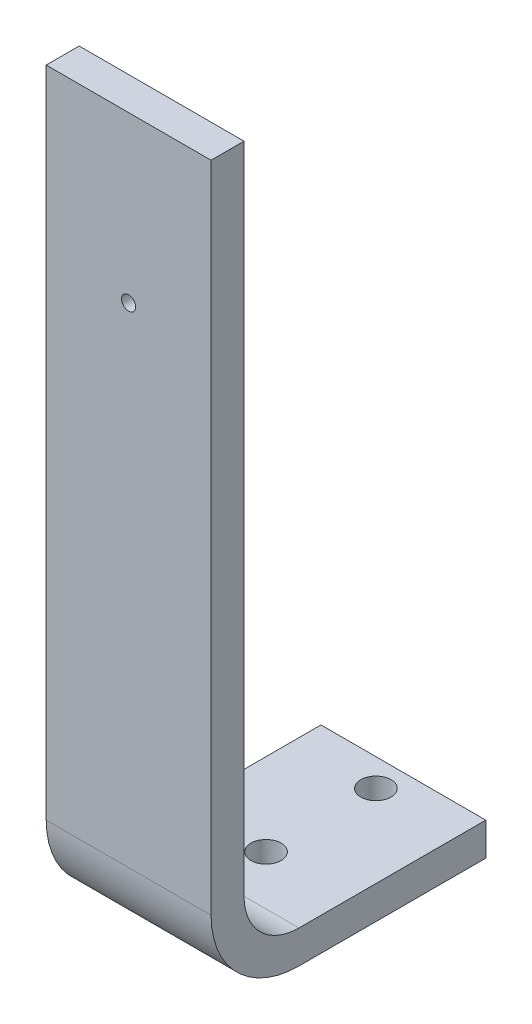
ISO-10303-21;
HEADER;
FILE_DESCRIPTION(('STEP AP214'),'2;1');
FILE_NAME('part.step','',(''),(''),'','','');
FILE_SCHEMA(('AUTOMOTIVE_DESIGN { 1 0 10303 214 1 1 1 1 }'));
ENDSEC;
DATA;
#1=APPLICATION_CONTEXT('core data for automotive mechanical design processes');
#2=APPLICATION_PROTOCOL_DEFINITION('international standard','automotive_design',2000,#1);
#3=PRODUCT_CONTEXT('',#1,'mechanical');
#4=PRODUCT('Part','Part','',(#3));
#5=PRODUCT_RELATED_PRODUCT_CATEGORY('part','',(#4));
#6=PRODUCT_DEFINITION_FORMATION('','',#4);
#7=PRODUCT_DEFINITION_CONTEXT('part definition',#1,'design');
#8=PRODUCT_DEFINITION('design','',#6,#7);
#9=PRODUCT_DEFINITION_SHAPE('','',#8);
#10=(LENGTH_UNIT() NAMED_UNIT(*) SI_UNIT(.MILLI.,.METRE.));
#11=(NAMED_UNIT(*) PLANE_ANGLE_UNIT() SI_UNIT($,.RADIAN.));
#12=(NAMED_UNIT(*) SI_UNIT($,.STERADIAN.) SOLID_ANGLE_UNIT());
#13=UNCERTAINTY_MEASURE_WITH_UNIT(LENGTH_MEASURE(1.E-05),#10,'distance_accuracy_value','');
#14=(GEOMETRIC_REPRESENTATION_CONTEXT(3) GLOBAL_UNCERTAINTY_ASSIGNED_CONTEXT((#13)) GLOBAL_UNIT_ASSIGNED_CONTEXT((#10,
#11,#12)) REPRESENTATION_CONTEXT('',''));
#15=CARTESIAN_POINT('',(0.,0.,0.));
#16=DIRECTION('',(0.,0.,1.));
#17=DIRECTION('',(1.,0.,0.));
#18=AXIS2_PLACEMENT_3D('',#15,#16,#17);
#19=CARTESIAN_POINT('',(30.,0.,0.));
#20=DIRECTION('',(0.,0.,-1.));
#21=DIRECTION('',(-1.,0.,0.));
#22=AXIS2_PLACEMENT_3D('',#19,#20,#21);
#23=PLANE('',#22);
#24=CARTESIAN_POINT('',(15.,105.,0.));
#25=DIRECTION('',(0.,0.,1.));
#26=DIRECTION('',(1.,0.,0.));
#27=AXIS2_PLACEMENT_3D('',#24,#25,#26);
#28=CIRCLE('',#27,1.28905);
#29=CARTESIAN_POINT('',(16.28905,105.,0.));
#30=VERTEX_POINT('',#29);
#31=EDGE_CURVE('E198',#30,#30,#28,.T.);
#32=ORIENTED_EDGE('',*,*,#31,.F.);
#33=EDGE_LOOP('',(#32));
#34=FACE_BOUND('',#33,.T.);
#35=DIRECTION('',(0.,-1.,0.));
#36=VECTOR('',#35,1.);
#37=CARTESIAN_POINT('',(0.,0.,0.));
#38=LINE('',#37,#36);
#39=CARTESIAN_POINT('',(0.,135.,0.));
#40=VERTEX_POINT('',#39);
#41=CARTESIAN_POINT('',(0.,16.,0.));
#42=VERTEX_POINT('',#41);
#43=EDGE_CURVE('E134',#40,#42,#38,.T.);
#44=ORIENTED_EDGE('',*,*,#43,.T.);
#45=DIRECTION('',(-1.,0.,0.));
#46=VECTOR('',#45,1.);
#47=CARTESIAN_POINT('',(30.,16.,0.));
#48=LINE('',#47,#46);
#49=CARTESIAN_POINT('',(30.,16.,0.));
#50=VERTEX_POINT('',#49);
#51=EDGE_CURVE('E43',#42,#50,#48,.F.);
#52=ORIENTED_EDGE('',*,*,#51,.T.);
#53=DIRECTION('',(0.,-1.,0.));
#54=VECTOR('',#53,1.);
#55=CARTESIAN_POINT('',(30.,0.,0.));
#56=LINE('',#55,#54);
#57=CARTESIAN_POINT('',(30.,135.,0.));
#58=VERTEX_POINT('',#57);
#59=EDGE_CURVE('E110',#58,#50,#56,.T.);
#60=ORIENTED_EDGE('',*,*,#59,.F.);
#61=DIRECTION('',(-1.,0.,0.));
#62=VECTOR('',#61,1.);
#63=CARTESIAN_POINT('',(30.,135.,0.));
#64=LINE('',#63,#62);
#65=EDGE_CURVE('E133',#58,#40,#64,.T.);
#66=ORIENTED_EDGE('',*,*,#65,.T.);
#67=EDGE_LOOP('',(#44,#52,#60,#66));
#68=FACE_BOUND('',#67,.T.);
#69=ADVANCED_FACE('F35',(#34,#68),#23,.F.);
#70=CARTESIAN_POINT('',(30.,0.,0.));
#71=DIRECTION('',(0.,1.,0.));
#72=DIRECTION('',(0.,0.,1.));
#73=AXIS2_PLACEMENT_3D('',#70,#71,#72);
#74=PLANE('',#73);
#75=CARTESIAN_POINT('',(15.,0.,-45.));
#76=DIRECTION('',(0.,1.,0.));
#77=DIRECTION('',(0.,0.,1.));
#78=AXIS2_PLACEMENT_3D('',#75,#76,#77);
#79=CIRCLE('',#78,2.75);
#80=CARTESIAN_POINT('',(15.,0.,-42.25));
#81=VERTEX_POINT('',#80);
#82=EDGE_CURVE('E189',#81,#81,#79,.T.);
#83=ORIENTED_EDGE('',*,*,#82,.T.);
#84=EDGE_LOOP('',(#83));
#85=FACE_BOUND('',#84,.T.);
#86=CARTESIAN_POINT('',(15.,0.,-25.));
#87=DIRECTION('',(0.,1.,0.));
#88=DIRECTION('',(0.,0.,1.));
#89=AXIS2_PLACEMENT_3D('',#86,#87,#88);
#90=CIRCLE('',#89,2.75);
#91=CARTESIAN_POINT('',(15.,0.,-22.25));
#92=VERTEX_POINT('',#91);
#93=EDGE_CURVE('E136',#92,#92,#90,.T.);
#94=ORIENTED_EDGE('',*,*,#93,.T.);
#95=EDGE_LOOP('',(#94));
#96=FACE_BOUND('',#95,.T.);
#97=DIRECTION('',(0.,0.,-1.));
#98=VECTOR('',#97,1.);
#99=CARTESIAN_POINT('',(30.,0.,0.));
#100=LINE('',#99,#98);
#101=CARTESIAN_POINT('',(30.,0.,-16.));
#102=VERTEX_POINT('',#101);
#103=CARTESIAN_POINT('',(30.,0.,-50.));
#104=VERTEX_POINT('',#103);
#105=EDGE_CURVE('E99',#102,#104,#100,.T.);
#106=ORIENTED_EDGE('',*,*,#105,.F.);
#107=DIRECTION('',(-1.,0.,0.));
#108=VECTOR('',#107,1.);
#109=CARTESIAN_POINT('',(30.,0.,-16.));
#110=LINE('',#109,#108);
#111=CARTESIAN_POINT('',(0.,0.,-16.));
#112=VERTEX_POINT('',#111);
#113=EDGE_CURVE('E161',#102,#112,#110,.T.);
#114=ORIENTED_EDGE('',*,*,#113,.T.);
#115=DIRECTION('',(0.,0.,-1.));
#116=VECTOR('',#115,1.);
#117=CARTESIAN_POINT('',(0.,0.,0.));
#118=LINE('',#117,#116);
#119=CARTESIAN_POINT('',(0.,0.,-50.));
#120=VERTEX_POINT('',#119);
#121=EDGE_CURVE('E115',#112,#120,#118,.T.);
#122=ORIENTED_EDGE('',*,*,#121,.T.);
#123=DIRECTION('',(-1.,0.,0.));
#124=VECTOR('',#123,1.);
#125=CARTESIAN_POINT('',(30.,0.,-50.));
#126=LINE('',#125,#124);
#127=EDGE_CURVE('E113',#104,#120,#126,.T.);
#128=ORIENTED_EDGE('',*,*,#127,.F.);
#129=EDGE_LOOP('',(#106,#114,#122,#128));
#130=FACE_BOUND('',#129,.T.);
#131=ADVANCED_FACE('F114',(#85,#96,#130),#74,.F.);
#132=CARTESIAN_POINT('',(30.,6.,-50.));
#133=DIRECTION('',(0.,0.,1.));
#134=DIRECTION('',(1.,0.,0.));
#135=AXIS2_PLACEMENT_3D('',#132,#133,#134);
#136=PLANE('',#135);
#137=DIRECTION('',(0.,1.,0.));
#138=VECTOR('',#137,1.);
#139=CARTESIAN_POINT('',(0.,6.,-50.));
#140=LINE('',#139,#138);
#141=CARTESIAN_POINT('',(0.,6.,-50.));
#142=VERTEX_POINT('',#141);
#143=EDGE_CURVE('E138',#120,#142,#140,.T.);
#144=ORIENTED_EDGE('',*,*,#143,.T.);
#145=DIRECTION('',(-1.,0.,0.));
#146=VECTOR('',#145,1.);
#147=CARTESIAN_POINT('',(30.,6.,-50.));
#148=LINE('',#147,#146);
#149=CARTESIAN_POINT('',(30.,6.,-50.));
#150=VERTEX_POINT('',#149);
#151=EDGE_CURVE('E119',#150,#142,#148,.T.);
#152=ORIENTED_EDGE('',*,*,#151,.F.);
#153=DIRECTION('',(0.,1.,0.));
#154=VECTOR('',#153,1.);
#155=CARTESIAN_POINT('',(30.,6.,-50.));
#156=LINE('',#155,#154);
#157=EDGE_CURVE('E104',#104,#150,#156,.T.);
#158=ORIENTED_EDGE('',*,*,#157,.F.);
#159=ORIENTED_EDGE('',*,*,#127,.T.);
#160=EDGE_LOOP('',(#144,#152,#158,#159));
#161=FACE_BOUND('',#160,.T.);
#162=ADVANCED_FACE('F121',(#161),#136,.F.);
#163=CARTESIAN_POINT('',(30.,6.,-6.));
#164=DIRECTION('',(0.,-1.,0.));
#165=DIRECTION('',(0.,0.,-1.));
#166=AXIS2_PLACEMENT_3D('',#163,#164,#165);
#167=PLANE('',#166);
#168=CARTESIAN_POINT('',(15.,6.,-45.));
#169=DIRECTION('',(0.,1.,0.));
#170=DIRECTION('',(0.,0.,1.));
#171=AXIS2_PLACEMENT_3D('',#168,#169,#170);
#172=CIRCLE('',#171,2.75);
#173=CARTESIAN_POINT('',(15.,6.,-42.25));
#174=VERTEX_POINT('',#173);
#175=EDGE_CURVE('E192',#174,#174,#172,.T.);
#176=ORIENTED_EDGE('',*,*,#175,.F.);
#177=EDGE_LOOP('',(#176));
#178=FACE_BOUND('',#177,.T.);
#179=CARTESIAN_POINT('',(15.,6.,-25.));
#180=DIRECTION('',(0.,1.,0.));
#181=DIRECTION('',(0.,0.,1.));
#182=AXIS2_PLACEMENT_3D('',#179,#180,#181);
#183=CIRCLE('',#182,2.75);
#184=CARTESIAN_POINT('',(15.,6.,-22.25));
#185=VERTEX_POINT('',#184);
#186=EDGE_CURVE('E186',#185,#185,#183,.T.);
#187=ORIENTED_EDGE('',*,*,#186,.F.);
#188=EDGE_LOOP('',(#187));
#189=FACE_BOUND('',#188,.T.);
#190=DIRECTION('',(0.,0.,1.));
#191=VECTOR('',#190,1.);
#192=CARTESIAN_POINT('',(0.,6.,-6.));
#193=LINE('',#192,#191);
#194=CARTESIAN_POINT('',(0.,6.,-16.));
#195=VERTEX_POINT('',#194);
#196=EDGE_CURVE('E140',#142,#195,#193,.T.);
#197=ORIENTED_EDGE('',*,*,#196,.T.);
#198=DIRECTION('',(-1.,0.,0.));
#199=VECTOR('',#198,1.);
#200=CARTESIAN_POINT('',(30.,6.,-16.));
#201=LINE('',#200,#199);
#202=CARTESIAN_POINT('',(30.,6.,-16.));
#203=VERTEX_POINT('',#202);
#204=EDGE_CURVE('E155',#195,#203,#201,.F.);
#205=ORIENTED_EDGE('',*,*,#204,.T.);
#206=DIRECTION('',(0.,0.,1.));
#207=VECTOR('',#206,1.);
#208=CARTESIAN_POINT('',(30.,6.,-6.));
#209=LINE('',#208,#207);
#210=EDGE_CURVE('E124',#150,#203,#209,.T.);
#211=ORIENTED_EDGE('',*,*,#210,.F.);
#212=ORIENTED_EDGE('',*,*,#151,.T.);
#213=EDGE_LOOP('',(#197,#205,#211,#212));
#214=FACE_BOUND('',#213,.T.);
#215=ADVANCED_FACE('F167',(#178,#189,#214),#167,.F.);
#216=CARTESIAN_POINT('',(30.,135.,-6.));
#217=DIRECTION('',(0.,0.,1.));
#218=DIRECTION('',(0.,-1.,0.));
#219=AXIS2_PLACEMENT_3D('',#216,#217,#218);
#220=PLANE('',#219);
#221=CARTESIAN_POINT('',(15.,105.,-6.));
#222=DIRECTION('',(0.,0.,1.));
#223=DIRECTION('',(0.,-1.,0.));
#224=AXIS2_PLACEMENT_3D('',#221,#222,#223);
#225=CIRCLE('',#224,1.28904999999999);
#226=CARTESIAN_POINT('',(15.,103.71095,-6.));
#227=VERTEX_POINT('',#226);
#228=EDGE_CURVE('E195',#227,#227,#225,.T.);
#229=ORIENTED_EDGE('',*,*,#228,.T.);
#230=EDGE_LOOP('',(#229));
#231=FACE_BOUND('',#230,.T.);
#232=DIRECTION('',(0.,1.,0.));
#233=VECTOR('',#232,1.);
#234=CARTESIAN_POINT('',(30.,135.,-6.));
#235=LINE('',#234,#233);
#236=CARTESIAN_POINT('',(30.,16.,-6.));
#237=VERTEX_POINT('',#236);
#238=CARTESIAN_POINT('',(30.,135.,-6.));
#239=VERTEX_POINT('',#238);
#240=EDGE_CURVE('E126',#237,#239,#235,.T.);
#241=ORIENTED_EDGE('',*,*,#240,.F.);
#242=DIRECTION('',(-1.,0.,0.));
#243=VECTOR('',#242,1.);
#244=CARTESIAN_POINT('',(0.,16.,-6.));
#245=LINE('',#244,#243);
#246=CARTESIAN_POINT('',(0.,16.,-6.));
#247=VERTEX_POINT('',#246);
#248=EDGE_CURVE('E118',#237,#247,#245,.T.);
#249=ORIENTED_EDGE('',*,*,#248,.T.);
#250=DIRECTION('',(0.,1.,0.));
#251=VECTOR('',#250,1.);
#252=CARTESIAN_POINT('',(0.,135.,-6.));
#253=LINE('',#252,#251);
#254=CARTESIAN_POINT('',(0.,135.,-6.));
#255=VERTEX_POINT('',#254);
#256=EDGE_CURVE('E143',#247,#255,#253,.T.);
#257=ORIENTED_EDGE('',*,*,#256,.T.);
#258=DIRECTION('',(-1.,0.,0.));
#259=VECTOR('',#258,1.);
#260=CARTESIAN_POINT('',(30.,135.,-6.));
#261=LINE('',#260,#259);
#262=EDGE_CURVE('E149',#239,#255,#261,.T.);
#263=ORIENTED_EDGE('',*,*,#262,.F.);
#264=EDGE_LOOP('',(#241,#249,#257,#263));
#265=FACE_BOUND('',#264,.T.);
#266=ADVANCED_FACE('F176',(#231,#265),#220,.F.);
#267=CARTESIAN_POINT('',(30.,135.,0.));
#268=DIRECTION('',(0.,-1.,0.));
#269=DIRECTION('',(0.,0.,-1.));
#270=AXIS2_PLACEMENT_3D('',#267,#268,#269);
#271=PLANE('',#270);
#272=DIRECTION('',(0.,0.,1.));
#273=VECTOR('',#272,1.);
#274=CARTESIAN_POINT('',(0.,135.,0.));
#275=LINE('',#274,#273);
#276=EDGE_CURVE('E145',#255,#40,#275,.T.);
#277=ORIENTED_EDGE('',*,*,#276,.T.);
#278=ORIENTED_EDGE('',*,*,#65,.F.);
#279=DIRECTION('',(0.,0.,1.));
#280=VECTOR('',#279,1.);
#281=CARTESIAN_POINT('',(30.,135.,0.));
#282=LINE('',#281,#280);
#283=EDGE_CURVE('E131',#239,#58,#282,.T.);
#284=ORIENTED_EDGE('',*,*,#283,.F.);
#285=ORIENTED_EDGE('',*,*,#262,.T.);
#286=EDGE_LOOP('',(#277,#278,#284,#285));
#287=FACE_BOUND('',#286,.T.);
#288=ADVANCED_FACE('F181',(#287),#271,.F.);
#289=CARTESIAN_POINT('',(30.,0.,0.));
#290=DIRECTION('',(-1.,0.,0.));
#291=DIRECTION('',(0.,0.,1.));
#292=AXIS2_PLACEMENT_3D('',#289,#290,#291);
#293=PLANE('',#292);
#294=ORIENTED_EDGE('',*,*,#59,.T.);
#295=CARTESIAN_POINT('',(30.,16.,-16.));
#296=DIRECTION('',(-1.,0.,0.));
#297=DIRECTION('',(0.,0.,1.));
#298=AXIS2_PLACEMENT_3D('',#295,#296,#297);
#299=CIRCLE('',#298,16.);
#300=EDGE_CURVE('E11',#50,#102,#299,.F.);
#301=ORIENTED_EDGE('',*,*,#300,.T.);
#302=ORIENTED_EDGE('',*,*,#105,.T.);
#303=ORIENTED_EDGE('',*,*,#157,.T.);
#304=ORIENTED_EDGE('',*,*,#210,.T.);
#305=CARTESIAN_POINT('',(30.,16.,-16.));
#306=DIRECTION('',(-1.,0.,0.));
#307=DIRECTION('',(0.,0.,1.));
#308=AXIS2_PLACEMENT_3D('',#305,#306,#307);
#309=CIRCLE('',#308,10.);
#310=EDGE_CURVE('E159',#203,#237,#309,.T.);
#311=ORIENTED_EDGE('',*,*,#310,.T.);
#312=ORIENTED_EDGE('',*,*,#240,.T.);
#313=ORIENTED_EDGE('',*,*,#283,.T.);
#314=EDGE_LOOP('',(#294,#301,#302,#303,#304,#311,#312,#313));
#315=FACE_BOUND('',#314,.T.);
#316=ADVANCED_FACE('F101',(#315),#293,.F.);
#317=CARTESIAN_POINT('',(0.,0.,0.));
#318=DIRECTION('',(-1.,0.,0.));
#319=DIRECTION('',(0.,0.,1.));
#320=AXIS2_PLACEMENT_3D('',#317,#318,#319);
#321=PLANE('',#320);
#322=ORIENTED_EDGE('',*,*,#121,.F.);
#323=CARTESIAN_POINT('',(0.,16.,-16.));
#324=DIRECTION('',(-1.,0.,0.));
#325=DIRECTION('',(0.,0.,1.));
#326=AXIS2_PLACEMENT_3D('',#323,#324,#325);
#327=CIRCLE('',#326,16.);
#328=EDGE_CURVE('E57',#112,#42,#327,.T.);
#329=ORIENTED_EDGE('',*,*,#328,.T.);
#330=ORIENTED_EDGE('',*,*,#43,.F.);
#331=ORIENTED_EDGE('',*,*,#276,.F.);
#332=ORIENTED_EDGE('',*,*,#256,.F.);
#333=CARTESIAN_POINT('',(0.,16.,-16.));
#334=DIRECTION('',(-1.,0.,0.));
#335=DIRECTION('',(0.,0.,1.));
#336=AXIS2_PLACEMENT_3D('',#333,#334,#335);
#337=CIRCLE('',#336,10.);
#338=EDGE_CURVE('E157',#247,#195,#337,.F.);
#339=ORIENTED_EDGE('',*,*,#338,.T.);
#340=ORIENTED_EDGE('',*,*,#196,.F.);
#341=ORIENTED_EDGE('',*,*,#143,.F.);
#342=EDGE_LOOP('',(#322,#329,#330,#331,#332,#339,#340,#341));
#343=FACE_BOUND('',#342,.T.);
#344=ADVANCED_FACE('F164',(#343),#321,.T.);
#345=CARTESIAN_POINT('',(30.,16.,-16.));
#346=DIRECTION('',(1.,0.,0.));
#347=DIRECTION('',(0.,0.,-1.));
#348=AXIS2_PLACEMENT_3D('',#345,#346,#347);
#349=CYLINDRICAL_SURFACE('',#348,10.);
#350=ORIENTED_EDGE('',*,*,#310,.F.);
#351=ORIENTED_EDGE('',*,*,#204,.F.);
#352=ORIENTED_EDGE('',*,*,#338,.F.);
#353=ORIENTED_EDGE('',*,*,#248,.F.);
#354=EDGE_LOOP('',(#350,#351,#352,#353));
#355=FACE_BOUND('',#354,.T.);
#356=ADVANCED_FACE('F173',(#355),#349,.F.);
#357=CARTESIAN_POINT('',(30.,16.,-16.));
#358=DIRECTION('',(-1.,0.,0.));
#359=DIRECTION('',(0.,0.,1.));
#360=AXIS2_PLACEMENT_3D('',#357,#358,#359);
#361=CYLINDRICAL_SURFACE('',#360,16.);
#362=ORIENTED_EDGE('',*,*,#300,.F.);
#363=ORIENTED_EDGE('',*,*,#51,.F.);
#364=ORIENTED_EDGE('',*,*,#328,.F.);
#365=ORIENTED_EDGE('',*,*,#113,.F.);
#366=EDGE_LOOP('',(#362,#363,#364,#365));
#367=FACE_BOUND('',#366,.T.);
#368=ADVANCED_FACE('F37',(#367),#361,.T.);
#369=CARTESIAN_POINT('',(15.,6.,-25.));
#370=DIRECTION('',(0.,1.,0.));
#371=DIRECTION('',(0.,0.,1.));
#372=AXIS2_PLACEMENT_3D('',#369,#370,#371);
#373=CYLINDRICAL_SURFACE('',#372,2.75);
#374=ORIENTED_EDGE('',*,*,#93,.F.);
#375=EDGE_LOOP('',(#374));
#376=FACE_BOUND('',#375,.T.);
#377=ORIENTED_EDGE('',*,*,#186,.T.);
#378=EDGE_LOOP('',(#377));
#379=FACE_BOUND('',#378,.T.);
#380=ADVANCED_FACE('F218',(#376,#379),#373,.F.);
#381=CARTESIAN_POINT('',(15.,6.,-45.));
#382=DIRECTION('',(0.,1.,0.));
#383=DIRECTION('',(0.,0.,1.));
#384=AXIS2_PLACEMENT_3D('',#381,#382,#383);
#385=CYLINDRICAL_SURFACE('',#384,2.75);
#386=ORIENTED_EDGE('',*,*,#82,.F.);
#387=EDGE_LOOP('',(#386));
#388=FACE_BOUND('',#387,.T.);
#389=ORIENTED_EDGE('',*,*,#175,.T.);
#390=EDGE_LOOP('',(#389));
#391=FACE_BOUND('',#390,.T.);
#392=ADVANCED_FACE('F291',(#388,#391),#385,.F.);
#393=CARTESIAN_POINT('',(15.,105.,0.));
#394=DIRECTION('',(0.,0.,1.));
#395=DIRECTION('',(1.,0.,0.));
#396=AXIS2_PLACEMENT_3D('',#393,#394,#395);
#397=CYLINDRICAL_SURFACE('',#396,1.28904999999999);
#398=ORIENTED_EDGE('',*,*,#31,.T.);
#399=EDGE_LOOP('',(#398));
#400=FACE_BOUND('',#399,.T.);
#401=ORIENTED_EDGE('',*,*,#228,.F.);
#402=EDGE_LOOP('',(#401));
#403=FACE_BOUND('',#402,.T.);
#404=ADVANCED_FACE('F202',(#400,#403),#397,.F.);
#405=CLOSED_SHELL('',(#69,#131,#162,#215,#266,#288,#316,#344,#356,#368,#380,#392,#404));
#406=MANIFOLD_SOLID_BREP('B2',#405);
#407=ADVANCED_BREP_SHAPE_REPRESENTATION('',(#18,#406),#14);
#408=SHAPE_DEFINITION_REPRESENTATION(#9,#407);
ENDSEC;
END-ISO-10303-21;
